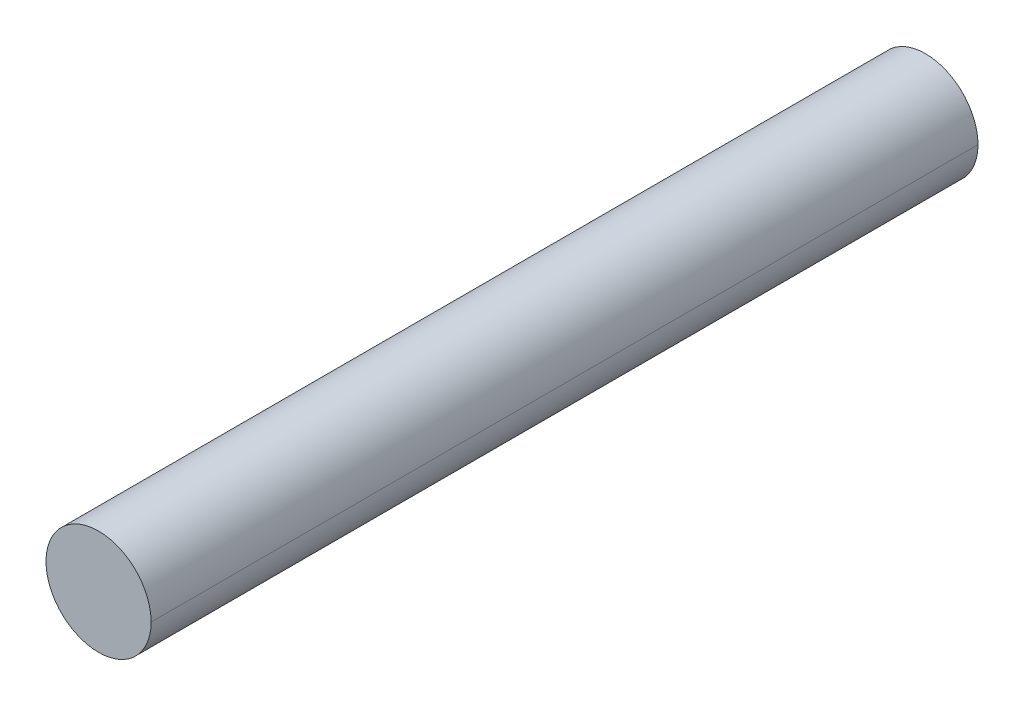
ISO-10303-21;
HEADER;
FILE_DESCRIPTION(('STEP AP214'),'2;1');
FILE_NAME('part.step','',(''),(''),'','','');
FILE_SCHEMA(('AUTOMOTIVE_DESIGN { 1 0 10303 214 1 1 1 1 }'));
ENDSEC;
DATA;
#1=APPLICATION_CONTEXT('core data for automotive mechanical design processes');
#2=APPLICATION_PROTOCOL_DEFINITION('international standard','automotive_design',2000,#1);
#3=PRODUCT_CONTEXT('',#1,'mechanical');
#4=PRODUCT('Part','Part','',(#3));
#5=PRODUCT_RELATED_PRODUCT_CATEGORY('part','',(#4));
#6=PRODUCT_DEFINITION_FORMATION('','',#4);
#7=PRODUCT_DEFINITION_CONTEXT('part definition',#1,'design');
#8=PRODUCT_DEFINITION('design','',#6,#7);
#9=PRODUCT_DEFINITION_SHAPE('','',#8);
#10=(LENGTH_UNIT() NAMED_UNIT(*) SI_UNIT(.MILLI.,.METRE.));
#11=(NAMED_UNIT(*) PLANE_ANGLE_UNIT() SI_UNIT($,.RADIAN.));
#12=(NAMED_UNIT(*) SI_UNIT($,.STERADIAN.) SOLID_ANGLE_UNIT());
#13=UNCERTAINTY_MEASURE_WITH_UNIT(LENGTH_MEASURE(1.E-05),#10,'distance_accuracy_value','');
#14=(GEOMETRIC_REPRESENTATION_CONTEXT(3) GLOBAL_UNCERTAINTY_ASSIGNED_CONTEXT((#13)) GLOBAL_UNIT_ASSIGNED_CONTEXT((#10,
#11,#12)) REPRESENTATION_CONTEXT('',''));
#15=CARTESIAN_POINT('',(0.,0.,0.));
#16=DIRECTION('',(0.,0.,1.));
#17=DIRECTION('',(1.,0.,0.));
#18=AXIS2_PLACEMENT_3D('',#15,#16,#17);
#19=CARTESIAN_POINT('',(0.,0.,-24.5364));
#20=DIRECTION('',(0.,0.,-1.));
#21=DIRECTION('',(0.,1.,0.));
#22=AXIS2_PLACEMENT_3D('',#19,#20,#21);
#23=CYLINDRICAL_SURFACE('',#22,1.55956);
#24=CARTESIAN_POINT('',(0.,0.,-24.5364));
#25=DIRECTION('',(0.,0.,1.));
#26=DIRECTION('',(1.,0.,0.));
#27=AXIS2_PLACEMENT_3D('',#24,#25,#26);
#28=CIRCLE('',#27,1.55956);
#29=CARTESIAN_POINT('',(-1.55956,0.,-24.5364));
#30=VERTEX_POINT('',#29);
#31=CARTESIAN_POINT('',(1.55956,0.,-24.5364));
#32=VERTEX_POINT('',#31);
#33=EDGE_CURVE('E11',#30,#32,#28,.T.);
#34=ORIENTED_EDGE('',*,*,#33,.T.);
#35=CARTESIAN_POINT('',(1.55956,0.,0.));
#36=DIRECTION('',(0.,0.,-1.));
#37=VECTOR('',#36,1.);
#38=LINE('',#35,#37);
#39=CARTESIAN_POINT('',(1.55956,0.,0.));
#40=VERTEX_POINT('',#39);
#41=EDGE_CURVE('E26',#40,#32,#38,.T.);
#42=ORIENTED_EDGE('',*,*,#41,.F.);
#43=CARTESIAN_POINT('',(0.,0.,0.));
#44=DIRECTION('',(0.,0.,1.));
#45=DIRECTION('',(1.,0.,0.));
#46=AXIS2_PLACEMENT_3D('',#43,#44,#45);
#47=CIRCLE('',#46,1.55956);
#48=CARTESIAN_POINT('',(-1.55956,0.,0.));
#49=VERTEX_POINT('',#48);
#50=EDGE_CURVE('E45',#49,#40,#47,.T.);
#51=ORIENTED_EDGE('',*,*,#50,.F.);
#52=CARTESIAN_POINT('',(-1.55956,0.,0.));
#53=DIRECTION('',(0.,0.,-1.));
#54=VECTOR('',#53,1.);
#55=LINE('',#52,#54);
#56=EDGE_CURVE('E41',#49,#30,#55,.T.);
#57=ORIENTED_EDGE('',*,*,#56,.T.);
#58=EDGE_LOOP('',(#34,#42,#51,#57));
#59=FACE_BOUND('',#58,.T.);
#60=ADVANCED_FACE('F17',(#59),#23,.T.);
#61=CARTESIAN_POINT('',(0.,0.,-24.5364));
#62=DIRECTION('',(0.,0.,-1.));
#63=DIRECTION('',(0.,-1.,0.));
#64=AXIS2_PLACEMENT_3D('',#61,#62,#63);
#65=CYLINDRICAL_SURFACE('',#64,1.55956);
#66=CARTESIAN_POINT('',(0.,0.,0.));
#67=DIRECTION('',(0.,0.,1.));
#68=DIRECTION('',(1.,0.,0.));
#69=AXIS2_PLACEMENT_3D('',#66,#67,#68);
#70=CIRCLE('',#69,1.55956);
#71=EDGE_CURVE('E49',#40,#49,#70,.T.);
#72=ORIENTED_EDGE('',*,*,#71,.F.);
#73=ORIENTED_EDGE('',*,*,#41,.T.);
#74=CARTESIAN_POINT('',(0.,0.,-24.5364));
#75=DIRECTION('',(0.,0.,1.));
#76=DIRECTION('',(1.,0.,0.));
#77=AXIS2_PLACEMENT_3D('',#74,#75,#76);
#78=CIRCLE('',#77,1.55956);
#79=EDGE_CURVE('E53',#32,#30,#78,.T.);
#80=ORIENTED_EDGE('',*,*,#79,.T.);
#81=ORIENTED_EDGE('',*,*,#56,.F.);
#82=EDGE_LOOP('',(#72,#73,#80,#81));
#83=FACE_BOUND('',#82,.T.);
#84=ADVANCED_FACE('F54',(#83),#65,.T.);
#85=CARTESIAN_POINT('',(0.,0.,-24.5364));
#86=DIRECTION('',(0.,0.,1.));
#87=DIRECTION('',(1.,0.,0.));
#88=AXIS2_PLACEMENT_3D('',#85,#86,#87);
#89=PLANE('',#88);
#90=ORIENTED_EDGE('',*,*,#79,.F.);
#91=ORIENTED_EDGE('',*,*,#33,.F.);
#92=EDGE_LOOP('',(#90,#91));
#93=FACE_BOUND('',#92,.T.);
#94=ADVANCED_FACE('F58',(#93),#89,.F.);
#95=CARTESIAN_POINT('',(0.,0.,0.));
#96=DIRECTION('',(0.,0.,1.));
#97=DIRECTION('',(1.,0.,0.));
#98=AXIS2_PLACEMENT_3D('',#95,#96,#97);
#99=PLANE('',#98);
#100=ORIENTED_EDGE('',*,*,#71,.T.);
#101=ORIENTED_EDGE('',*,*,#50,.T.);
#102=EDGE_LOOP('',(#100,#101));
#103=FACE_BOUND('',#102,.T.);
#104=ADVANCED_FACE('F60',(#103),#99,.T.);
#105=CLOSED_SHELL('',(#60,#84,#94,#104));
#106=MANIFOLD_SOLID_BREP('B1',#105);
#107=ADVANCED_BREP_SHAPE_REPRESENTATION('',(#18,#106),#14);
#108=SHAPE_DEFINITION_REPRESENTATION(#9,#107);
ENDSEC;
END-ISO-10303-21;
